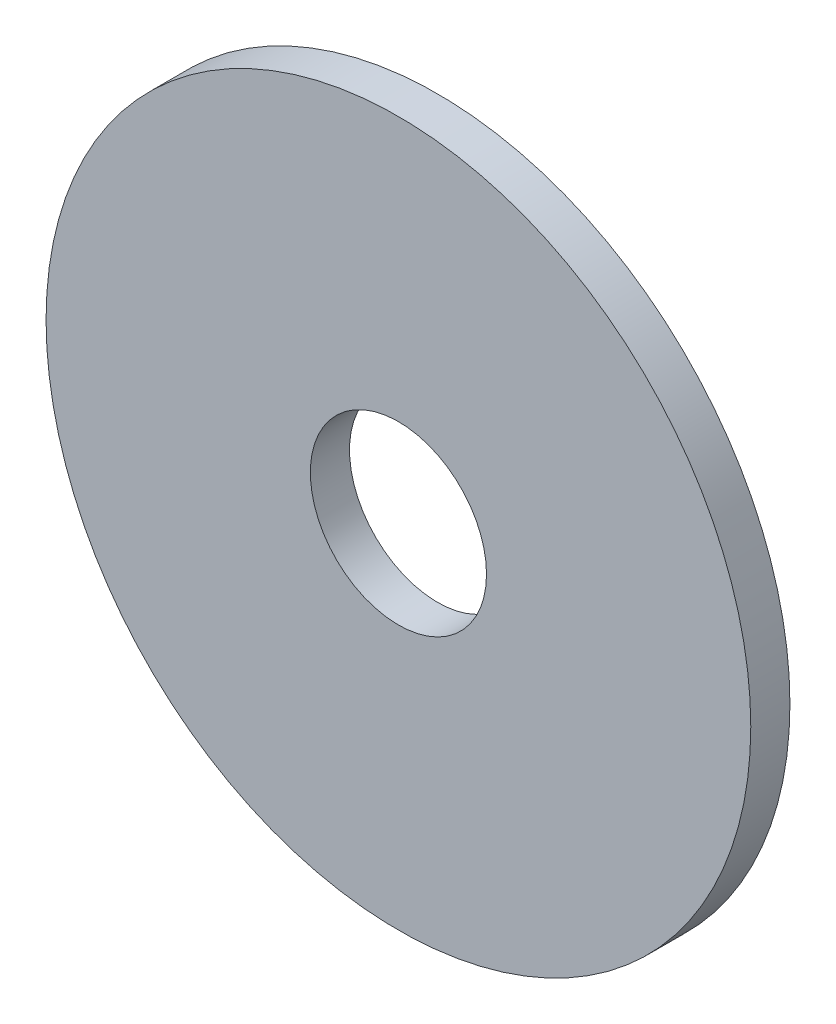
ISO-10303-21;
HEADER;
FILE_DESCRIPTION(('STEP AP214'),'2;1');
FILE_NAME('part.step','',(''),(''),'','','');
FILE_SCHEMA(('AUTOMOTIVE_DESIGN { 1 0 10303 214 1 1 1 1 }'));
ENDSEC;
DATA;
#1=APPLICATION_CONTEXT('core data for automotive mechanical design processes');
#2=APPLICATION_PROTOCOL_DEFINITION('international standard','automotive_design',2000,#1);
#3=PRODUCT_CONTEXT('',#1,'mechanical');
#4=PRODUCT('Part','Part','',(#3));
#5=PRODUCT_RELATED_PRODUCT_CATEGORY('part','',(#4));
#6=PRODUCT_DEFINITION_FORMATION('','',#4);
#7=PRODUCT_DEFINITION_CONTEXT('part definition',#1,'design');
#8=PRODUCT_DEFINITION('design','',#6,#7);
#9=PRODUCT_DEFINITION_SHAPE('','',#8);
#10=(LENGTH_UNIT() NAMED_UNIT(*) SI_UNIT(.MILLI.,.METRE.));
#11=(NAMED_UNIT(*) PLANE_ANGLE_UNIT() SI_UNIT($,.RADIAN.));
#12=(NAMED_UNIT(*) SI_UNIT($,.STERADIAN.) SOLID_ANGLE_UNIT());
#13=UNCERTAINTY_MEASURE_WITH_UNIT(LENGTH_MEASURE(1.E-05),#10,'distance_accuracy_value','');
#14=(GEOMETRIC_REPRESENTATION_CONTEXT(3) GLOBAL_UNCERTAINTY_ASSIGNED_CONTEXT((#13)) GLOBAL_UNIT_ASSIGNED_CONTEXT((#10,
#11,#12)) REPRESENTATION_CONTEXT('',''));
#15=CARTESIAN_POINT('',(0.,0.,0.));
#16=DIRECTION('',(0.,0.,1.));
#17=DIRECTION('',(1.,0.,0.));
#18=AXIS2_PLACEMENT_3D('',#15,#16,#17);
#19=CARTESIAN_POINT('',(0.,0.,0.5));
#20=DIRECTION('',(0.,0.,1.));
#21=DIRECTION('',(1.,0.,0.));
#22=AXIS2_PLACEMENT_3D('',#19,#20,#21);
#23=PLANE('',#22);
#24=CARTESIAN_POINT('',(0.,0.,0.5));
#25=DIRECTION('',(0.,0.,1.));
#26=DIRECTION('',(1.,0.,0.));
#27=AXIS2_PLACEMENT_3D('',#24,#25,#26);
#28=CIRCLE('',#27,9.);
#29=CARTESIAN_POINT('',(9.,0.,0.5));
#30=VERTEX_POINT('',#29);
#31=EDGE_CURVE('E10',#30,#30,#28,.T.);
#32=ORIENTED_EDGE('',*,*,#31,.T.);
#33=EDGE_LOOP('',(#32));
#34=FACE_BOUND('',#33,.T.);
#35=CARTESIAN_POINT('',(0.,0.,0.5));
#36=DIRECTION('',(0.,0.,1.));
#37=DIRECTION('',(1.,0.,0.));
#38=AXIS2_PLACEMENT_3D('',#35,#36,#37);
#39=CIRCLE('',#38,2.25);
#40=CARTESIAN_POINT('',(2.25,0.,0.5));
#41=VERTEX_POINT('',#40);
#42=EDGE_CURVE('E52',#41,#41,#39,.T.);
#43=ORIENTED_EDGE('',*,*,#42,.F.);
#44=EDGE_LOOP('',(#43));
#45=FACE_BOUND('',#44,.T.);
#46=ADVANCED_FACE('F41',(#34,#45),#23,.T.);
#47=CARTESIAN_POINT('',(0.,0.,-0.5));
#48=DIRECTION('',(0.,0.,1.));
#49=DIRECTION('',(1.,0.,0.));
#50=AXIS2_PLACEMENT_3D('',#47,#48,#49);
#51=PLANE('',#50);
#52=CARTESIAN_POINT('',(0.,0.,-0.5));
#53=DIRECTION('',(0.,0.,1.));
#54=DIRECTION('',(1.,0.,0.));
#55=AXIS2_PLACEMENT_3D('',#52,#53,#54);
#56=CIRCLE('',#55,9.);
#57=CARTESIAN_POINT('',(9.,0.,-0.5));
#58=VERTEX_POINT('',#57);
#59=EDGE_CURVE('E45',#58,#58,#56,.T.);
#60=ORIENTED_EDGE('',*,*,#59,.F.);
#61=EDGE_LOOP('',(#60));
#62=FACE_BOUND('',#61,.T.);
#63=CARTESIAN_POINT('',(0.,0.,-0.5));
#64=DIRECTION('',(0.,0.,1.));
#65=DIRECTION('',(1.,0.,0.));
#66=AXIS2_PLACEMENT_3D('',#63,#64,#65);
#67=CIRCLE('',#66,2.25);
#68=CARTESIAN_POINT('',(2.25,0.,-0.5));
#69=VERTEX_POINT('',#68);
#70=EDGE_CURVE('E54',#69,#69,#67,.T.);
#71=ORIENTED_EDGE('',*,*,#70,.T.);
#72=EDGE_LOOP('',(#71));
#73=FACE_BOUND('',#72,.T.);
#74=ADVANCED_FACE('F64',(#62,#73),#51,.F.);
#75=CARTESIAN_POINT('',(0.,0.,0.5));
#76=DIRECTION('',(0.,0.,-1.));
#77=DIRECTION('',(-1.,0.,0.));
#78=AXIS2_PLACEMENT_3D('',#75,#76,#77);
#79=CYLINDRICAL_SURFACE('',#78,9.);
#80=ORIENTED_EDGE('',*,*,#31,.F.);
#81=EDGE_LOOP('',(#80));
#82=FACE_BOUND('',#81,.T.);
#83=ORIENTED_EDGE('',*,*,#59,.T.);
#84=EDGE_LOOP('',(#83));
#85=FACE_BOUND('',#84,.T.);
#86=ADVANCED_FACE('F43',(#82,#85),#79,.T.);
#87=CARTESIAN_POINT('',(0.,0.,0.5));
#88=DIRECTION('',(0.,0.,-1.));
#89=DIRECTION('',(-1.,0.,0.));
#90=AXIS2_PLACEMENT_3D('',#87,#88,#89);
#91=CYLINDRICAL_SURFACE('',#90,2.25);
#92=ORIENTED_EDGE('',*,*,#42,.T.);
#93=EDGE_LOOP('',(#92));
#94=FACE_BOUND('',#93,.T.);
#95=ORIENTED_EDGE('',*,*,#70,.F.);
#96=EDGE_LOOP('',(#95));
#97=FACE_BOUND('',#96,.T.);
#98=ADVANCED_FACE('F60',(#94,#97),#91,.F.);
#99=CLOSED_SHELL('',(#46,#74,#86,#98));
#100=MANIFOLD_SOLID_BREP('B2',#99);
#101=ADVANCED_BREP_SHAPE_REPRESENTATION('',(#18,#100),#14);
#102=SHAPE_DEFINITION_REPRESENTATION(#9,#101);
ENDSEC;
END-ISO-10303-21;
